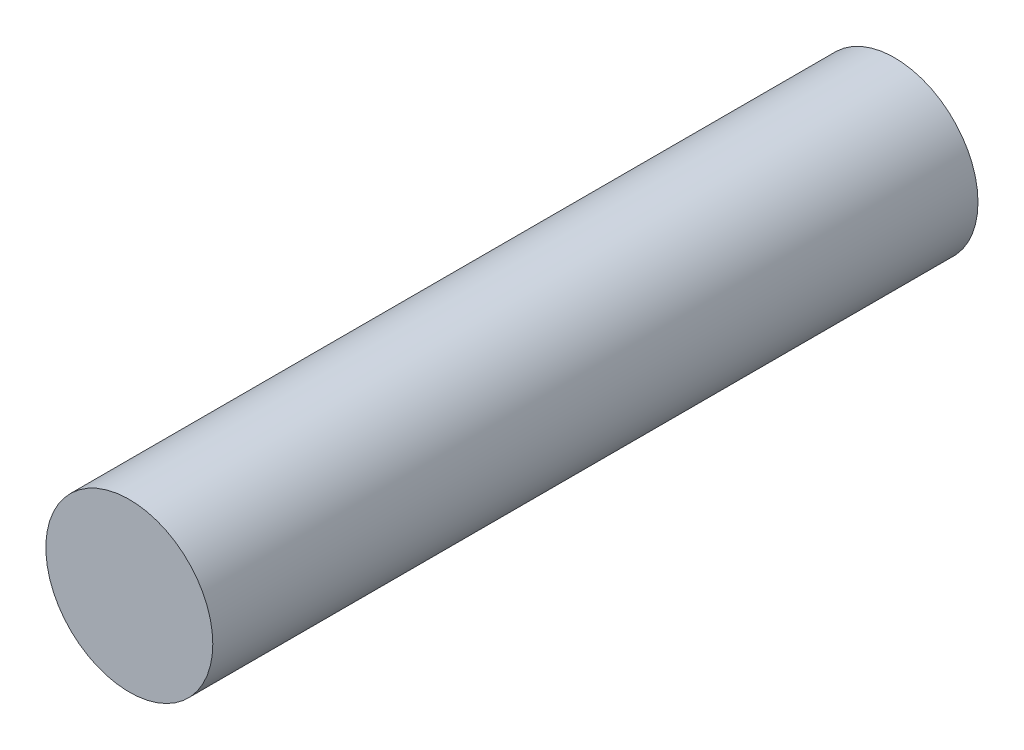
ISO-10303-21;
HEADER;
FILE_DESCRIPTION(('STEP AP214'),'2;1');
FILE_NAME('part.step','',(''),(''),'','','');
FILE_SCHEMA(('AUTOMOTIVE_DESIGN { 1 0 10303 214 1 1 1 1 }'));
ENDSEC;
DATA;
#1=APPLICATION_CONTEXT('core data for automotive mechanical design processes');
#2=APPLICATION_PROTOCOL_DEFINITION('international standard','automotive_design',2000,#1);
#3=PRODUCT_CONTEXT('',#1,'mechanical');
#4=PRODUCT('Part','Part','',(#3));
#5=PRODUCT_RELATED_PRODUCT_CATEGORY('part','',(#4));
#6=PRODUCT_DEFINITION_FORMATION('','',#4);
#7=PRODUCT_DEFINITION_CONTEXT('part definition',#1,'design');
#8=PRODUCT_DEFINITION('design','',#6,#7);
#9=PRODUCT_DEFINITION_SHAPE('','',#8);
#10=(LENGTH_UNIT() NAMED_UNIT(*) SI_UNIT(.MILLI.,.METRE.));
#11=(NAMED_UNIT(*) PLANE_ANGLE_UNIT() SI_UNIT($,.RADIAN.));
#12=(NAMED_UNIT(*) SI_UNIT($,.STERADIAN.) SOLID_ANGLE_UNIT());
#13=UNCERTAINTY_MEASURE_WITH_UNIT(LENGTH_MEASURE(1.E-05),#10,'distance_accuracy_value','');
#14=(GEOMETRIC_REPRESENTATION_CONTEXT(3) GLOBAL_UNCERTAINTY_ASSIGNED_CONTEXT((#13)) GLOBAL_UNIT_ASSIGNED_CONTEXT((#10,
#11,#12)) REPRESENTATION_CONTEXT('',''));
#15=CARTESIAN_POINT('',(0.,0.,0.));
#16=DIRECTION('',(0.,0.,1.));
#17=DIRECTION('',(1.,0.,0.));
#18=AXIS2_PLACEMENT_3D('',#15,#16,#17);
#19=CARTESIAN_POINT('',(0.,0.,55.));
#20=DIRECTION('',(0.,0.,-1.));
#21=DIRECTION('',(-1.,0.,0.));
#22=AXIS2_PLACEMENT_3D('',#19,#20,#21);
#23=CYLINDRICAL_SURFACE('',#22,6.);
#24=CARTESIAN_POINT('',(0.,0.,55.));
#25=DIRECTION('',(0.,0.,1.));
#26=DIRECTION('',(1.,0.,0.));
#27=AXIS2_PLACEMENT_3D('',#24,#25,#26);
#28=CIRCLE('',#27,6.);
#29=CARTESIAN_POINT('',(6.,0.,55.));
#30=VERTEX_POINT('',#29);
#31=EDGE_CURVE('E10',#30,#30,#28,.T.);
#32=ORIENTED_EDGE('',*,*,#31,.F.);
#33=EDGE_LOOP('',(#32));
#34=FACE_BOUND('',#33,.T.);
#35=CARTESIAN_POINT('',(0.,0.,0.));
#36=DIRECTION('',(0.,0.,1.));
#37=DIRECTION('',(1.,0.,0.));
#38=AXIS2_PLACEMENT_3D('',#35,#36,#37);
#39=CIRCLE('',#38,6.);
#40=CARTESIAN_POINT('',(6.,0.,0.));
#41=VERTEX_POINT('',#40);
#42=EDGE_CURVE('E35',#41,#41,#39,.T.);
#43=ORIENTED_EDGE('',*,*,#42,.T.);
#44=EDGE_LOOP('',(#43));
#45=FACE_BOUND('',#44,.T.);
#46=ADVANCED_FACE('F32',(#34,#45),#23,.T.);
#47=CARTESIAN_POINT('',(0.,0.,55.));
#48=DIRECTION('',(0.,0.,1.));
#49=DIRECTION('',(1.,0.,0.));
#50=AXIS2_PLACEMENT_3D('',#47,#48,#49);
#51=PLANE('',#50);
#52=ORIENTED_EDGE('',*,*,#31,.T.);
#53=EDGE_LOOP('',(#52));
#54=FACE_BOUND('',#53,.T.);
#55=ADVANCED_FACE('F47',(#54),#51,.T.);
#56=CARTESIAN_POINT('',(0.,0.,0.));
#57=DIRECTION('',(0.,0.,1.));
#58=DIRECTION('',(1.,0.,0.));
#59=AXIS2_PLACEMENT_3D('',#56,#57,#58);
#60=PLANE('',#59);
#61=ORIENTED_EDGE('',*,*,#42,.F.);
#62=EDGE_LOOP('',(#61));
#63=FACE_BOUND('',#62,.T.);
#64=ADVANCED_FACE('F45',(#63),#60,.F.);
#65=CLOSED_SHELL('',(#46,#55,#64));
#66=MANIFOLD_SOLID_BREP('B2',#65);
#67=ADVANCED_BREP_SHAPE_REPRESENTATION('',(#18,#66),#14);
#68=SHAPE_DEFINITION_REPRESENTATION(#9,#67);
ENDSEC;
END-ISO-10303-21;
